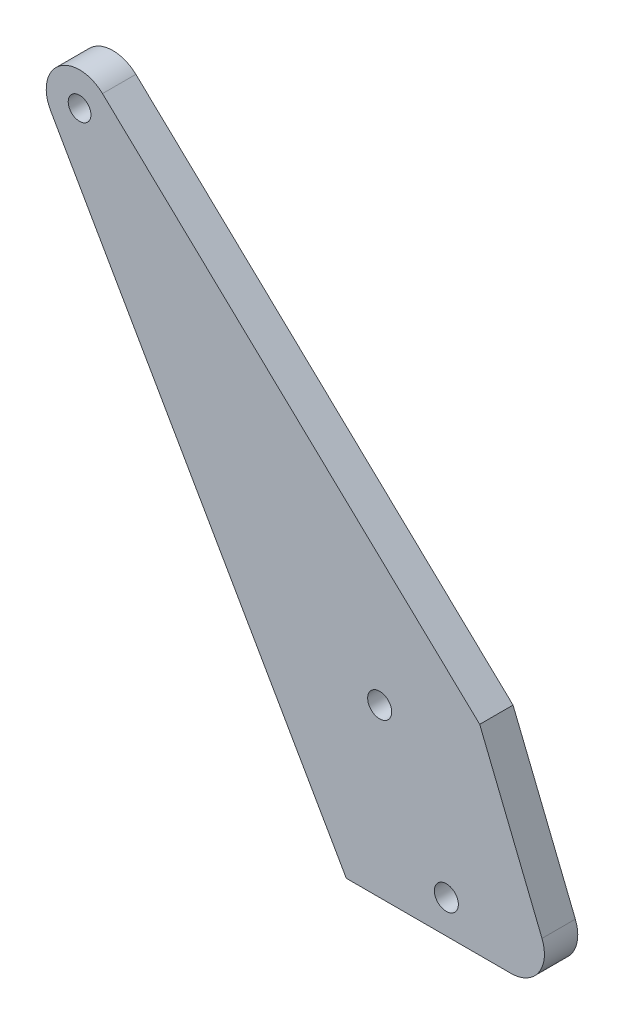
ISO-10303-21;
HEADER;
FILE_DESCRIPTION(('STEP AP214'),'2;1');
FILE_NAME('part.step','',(''),(''),'','','');
FILE_SCHEMA(('AUTOMOTIVE_DESIGN { 1 0 10303 214 1 1 1 1 }'));
ENDSEC;
DATA;
#1=APPLICATION_CONTEXT('core data for automotive mechanical design processes');
#2=APPLICATION_PROTOCOL_DEFINITION('international standard','automotive_design',2000,#1);
#3=PRODUCT_CONTEXT('',#1,'mechanical');
#4=PRODUCT('Part','Part','',(#3));
#5=PRODUCT_RELATED_PRODUCT_CATEGORY('part','',(#4));
#6=PRODUCT_DEFINITION_FORMATION('','',#4);
#7=PRODUCT_DEFINITION_CONTEXT('part definition',#1,'design');
#8=PRODUCT_DEFINITION('design','',#6,#7);
#9=PRODUCT_DEFINITION_SHAPE('','',#8);
#10=(LENGTH_UNIT() NAMED_UNIT(*) SI_UNIT(.MILLI.,.METRE.));
#11=(NAMED_UNIT(*) PLANE_ANGLE_UNIT() SI_UNIT($,.RADIAN.));
#12=(NAMED_UNIT(*) SI_UNIT($,.STERADIAN.) SOLID_ANGLE_UNIT());
#13=UNCERTAINTY_MEASURE_WITH_UNIT(LENGTH_MEASURE(1.E-05),#10,'distance_accuracy_value','');
#14=(GEOMETRIC_REPRESENTATION_CONTEXT(3) GLOBAL_UNCERTAINTY_ASSIGNED_CONTEXT((#13)) GLOBAL_UNIT_ASSIGNED_CONTEXT((#10,
#11,#12)) REPRESENTATION_CONTEXT('',''));
#15=CARTESIAN_POINT('',(0.,0.,0.));
#16=DIRECTION('',(0.,0.,1.));
#17=DIRECTION('',(1.,0.,0.));
#18=AXIS2_PLACEMENT_3D('',#15,#16,#17);
#19=CARTESIAN_POINT('',(0.,0.,-6.35));
#20=DIRECTION('',(0.,-1.,0.));
#21=DIRECTION('',(0.,0.,-1.));
#22=AXIS2_PLACEMENT_3D('',#19,#20,#21);
#23=PLANE('',#22);
#24=DIRECTION('',(1.,0.,0.));
#25=VECTOR('',#24,1.);
#26=CARTESIAN_POINT('',(15.3933992043195,0.,-6.35));
#27=LINE('',#26,#25);
#28=CARTESIAN_POINT('',(-25.4,0.,-6.35));
#29=VERTEX_POINT('',#28);
#30=CARTESIAN_POINT('',(5.97913705426362,0.,-6.35));
#31=VERTEX_POINT('',#30);
#32=EDGE_CURVE('E115',#29,#31,#27,.T.);
#33=ORIENTED_EDGE('',*,*,#32,.T.);
#34=DIRECTION('',(0.,0.,1.));
#35=VECTOR('',#34,1.);
#36=CARTESIAN_POINT('',(5.97913705426361,0.,-6.35));
#37=LINE('',#36,#35);
#38=CARTESIAN_POINT('',(5.97913705426361,0.,0.));
#39=VERTEX_POINT('',#38);
#40=EDGE_CURVE('E160',#31,#39,#37,.T.);
#41=ORIENTED_EDGE('',*,*,#40,.T.);
#42=DIRECTION('',(1.,0.,0.));
#43=VECTOR('',#42,1.);
#44=CARTESIAN_POINT('',(0.,0.,0.));
#45=LINE('',#44,#43);
#46=CARTESIAN_POINT('',(-25.4,0.,0.));
#47=VERTEX_POINT('',#46);
#48=EDGE_CURVE('E154',#47,#39,#45,.T.);
#49=ORIENTED_EDGE('',*,*,#48,.F.);
#50=DIRECTION('',(0.,0.,1.));
#51=VECTOR('',#50,1.);
#52=CARTESIAN_POINT('',(-25.4,0.,-6.35));
#53=LINE('',#52,#51);
#54=EDGE_CURVE('E157',#29,#47,#53,.T.);
#55=ORIENTED_EDGE('',*,*,#54,.F.);
#56=EDGE_LOOP('',(#33,#41,#49,#55));
#57=FACE_BOUND('',#56,.T.);
#58=ADVANCED_FACE('F49',(#57),#23,.T.);
#59=CARTESIAN_POINT('',(-81.7119813240942,98.4471343383664,-6.35));
#60=DIRECTION('',(-0.868028554975459,-0.49651427748577,0.));
#61=DIRECTION('',(0.49651427748577,-0.868028554975459,0.));
#62=AXIS2_PLACEMENT_3D('',#59,#60,#61);
#63=PLANE('',#62);
#64=DIRECTION('',(0.49651427748577,-0.868028554975459,0.));
#65=VECTOR('',#64,1.);
#66=CARTESIAN_POINT('',(-81.7119813240942,98.4471343383664,0.));
#67=LINE('',#66,#65);
#68=CARTESIAN_POINT('',(-81.7119813240942,98.4471343383664,0.));
#69=VERTEX_POINT('',#68);
#70=EDGE_CURVE('E150',#69,#47,#67,.T.);
#71=ORIENTED_EDGE('',*,*,#70,.F.);
#72=DIRECTION('',(0.,0.,1.));
#73=VECTOR('',#72,1.);
#74=CARTESIAN_POINT('',(-81.7119813240942,98.4471343383664,-6.35));
#75=LINE('',#74,#73);
#76=CARTESIAN_POINT('',(-81.7119813240942,98.4471343383664,-6.35));
#77=VERTEX_POINT('',#76);
#78=EDGE_CURVE('E161',#77,#69,#75,.T.);
#79=ORIENTED_EDGE('',*,*,#78,.F.);
#80=DIRECTION('',(0.49651427748577,-0.868028554975459,0.));
#81=VECTOR('',#80,1.);
#82=CARTESIAN_POINT('',(-81.7119813240942,98.4471343383664,-6.35));
#83=LINE('',#82,#81);
#84=EDGE_CURVE('E124',#77,#29,#83,.T.);
#85=ORIENTED_EDGE('',*,*,#84,.T.);
#86=ORIENTED_EDGE('',*,*,#54,.T.);
#87=EDGE_LOOP('',(#71,#79,#85,#86));
#88=FACE_BOUND('',#87,.T.);
#89=ADVANCED_FACE('F224',(#88),#63,.T.);
#90=CARTESIAN_POINT('',(-76.2,101.600000000401,-6.35));
#91=DIRECTION('',(0.,0.,1.));
#92=DIRECTION('',(1.,0.,0.));
#93=AXIS2_PLACEMENT_3D('',#90,#91,#92);
#94=CYLINDRICAL_SURFACE('',#93,6.34999999999999);
#95=CARTESIAN_POINT('',(-76.2,101.600000000401,0.));
#96=DIRECTION('',(0.,0.,1.));
#97=DIRECTION('',(1.,0.,0.));
#98=AXIS2_PLACEMENT_3D('',#95,#96,#97);
#99=CIRCLE('',#98,6.34999999999999);
#100=CARTESIAN_POINT('',(-71.830872801111,106.207952639039,0.));
#101=VERTEX_POINT('',#100);
#102=EDGE_CURVE('E147',#101,#69,#99,.T.);
#103=ORIENTED_EDGE('',*,*,#102,.F.);
#104=DIRECTION('',(0.,0.,1.));
#105=VECTOR('',#104,1.);
#106=CARTESIAN_POINT('',(-71.830872801111,106.207952639039,-6.35));
#107=LINE('',#106,#105);
#108=CARTESIAN_POINT('',(-71.830872801111,106.207952639039,-6.35));
#109=VERTEX_POINT('',#108);
#110=EDGE_CURVE('E123',#109,#101,#107,.T.);
#111=ORIENTED_EDGE('',*,*,#110,.F.);
#112=CARTESIAN_POINT('',(-76.2,101.600000000401,-6.35));
#113=DIRECTION('',(0.,0.,1.));
#114=DIRECTION('',(1.,0.,0.));
#115=AXIS2_PLACEMENT_3D('',#112,#113,#114);
#116=CIRCLE('',#115,6.34999999999999);
#117=EDGE_CURVE('E130',#109,#77,#116,.T.);
#118=ORIENTED_EDGE('',*,*,#117,.T.);
#119=ORIENTED_EDGE('',*,*,#78,.T.);
#120=EDGE_LOOP('',(#103,#111,#118,#119));
#121=FACE_BOUND('',#120,.T.);
#122=ADVANCED_FACE('F223',(#121),#94,.T.);
#123=CARTESIAN_POINT('',(-71.830872801111,106.207952639039,-6.35));
#124=DIRECTION('',(0.688051527384096,0.725661832856333,0.));
#125=DIRECTION('',(-0.725661832856333,0.688051527384096,0.));
#126=AXIS2_PLACEMENT_3D('',#123,#124,#125);
#127=PLANE('',#126);
#128=DIRECTION('',(-0.725661832856333,0.688051527384096,0.));
#129=VECTOR('',#128,1.);
#130=CARTESIAN_POINT('',(-71.830872801111,106.207952639039,0.));
#131=LINE('',#130,#129);
#132=CARTESIAN_POINT('',(0.,38.1,0.));
#133=VERTEX_POINT('',#132);
#134=EDGE_CURVE('E121',#133,#101,#131,.T.);
#135=ORIENTED_EDGE('',*,*,#134,.F.);
#136=DIRECTION('',(0.,0.,1.));
#137=VECTOR('',#136,1.);
#138=CARTESIAN_POINT('',(0.,38.1,-6.35));
#139=LINE('',#138,#137);
#140=CARTESIAN_POINT('',(0.,38.1,-6.35));
#141=VERTEX_POINT('',#140);
#142=EDGE_CURVE('E108',#141,#133,#139,.T.);
#143=ORIENTED_EDGE('',*,*,#142,.F.);
#144=DIRECTION('',(-0.725661832856333,0.688051527384096,0.));
#145=VECTOR('',#144,1.);
#146=CARTESIAN_POINT('',(-71.830872801111,106.207952639039,-6.35));
#147=LINE('',#146,#145);
#148=EDGE_CURVE('E114',#141,#109,#147,.T.);
#149=ORIENTED_EDGE('',*,*,#148,.T.);
#150=ORIENTED_EDGE('',*,*,#110,.T.);
#151=EDGE_LOOP('',(#135,#143,#149,#150));
#152=FACE_BOUND('',#151,.T.);
#153=ADVANCED_FACE('F119',(#152),#127,.T.);
#154=CARTESIAN_POINT('',(0.,38.1,-6.35));
#155=DIRECTION('',(0.927183854566787,0.374606593415913,0.));
#156=DIRECTION('',(-0.374606593415913,0.927183854566787,0.));
#157=AXIS2_PLACEMENT_3D('',#154,#155,#156);
#158=PLANE('',#157);
#159=DIRECTION('',(-0.374606593415913,0.927183854566787,0.));
#160=VECTOR('',#159,1.);
#161=CARTESIAN_POINT('',(0.,38.1,0.));
#162=LINE('',#161,#160);
#163=CARTESIAN_POINT('',(11.8667545307627,8.72875186819105,0.));
#164=VERTEX_POINT('',#163);
#165=EDGE_CURVE('E141',#164,#133,#162,.T.);
#166=ORIENTED_EDGE('',*,*,#165,.F.);
#167=DIRECTION('',(0.,0.,1.));
#168=VECTOR('',#167,1.);
#169=CARTESIAN_POINT('',(11.8667545307627,8.72875186819105,-6.35));
#170=LINE('',#169,#168);
#171=CARTESIAN_POINT('',(11.8667545307627,8.72875186819105,-6.35));
#172=VERTEX_POINT('',#171);
#173=EDGE_CURVE('E58',#164,#172,#170,.F.);
#174=ORIENTED_EDGE('',*,*,#173,.T.);
#175=DIRECTION('',(-0.374606593415913,0.927183854566787,0.));
#176=VECTOR('',#175,1.);
#177=CARTESIAN_POINT('',(0.,38.1,-6.35));
#178=LINE('',#177,#176);
#179=EDGE_CURVE('E105',#172,#141,#178,.T.);
#180=ORIENTED_EDGE('',*,*,#179,.T.);
#181=ORIENTED_EDGE('',*,*,#142,.T.);
#182=EDGE_LOOP('',(#166,#174,#180,#181));
#183=FACE_BOUND('',#182,.T.);
#184=ADVANCED_FACE('F107',(#183),#158,.T.);
#185=CARTESIAN_POINT('',(-76.2,101.600000000401,-6.35));
#186=DIRECTION('',(0.,0.,1.));
#187=DIRECTION('',(1.,0.,0.));
#188=AXIS2_PLACEMENT_3D('',#185,#186,#187);
#189=PLANE('',#188);
#190=CARTESIAN_POINT('',(-6.35,6.35,-6.35));
#191=DIRECTION('',(0.,0.,1.));
#192=DIRECTION('',(1.,0.,0.));
#193=AXIS2_PLACEMENT_3D('',#190,#191,#192);
#194=CIRCLE('',#193,2.286);
#195=CARTESIAN_POINT('',(-4.064,6.35,-6.35));
#196=VERTEX_POINT('',#195);
#197=EDGE_CURVE('E172',#196,#196,#194,.T.);
#198=ORIENTED_EDGE('',*,*,#197,.T.);
#199=EDGE_LOOP('',(#198));
#200=FACE_BOUND('',#199,.T.);
#201=CARTESIAN_POINT('',(-76.2,101.600000000401,-6.35));
#202=DIRECTION('',(0.,0.,1.));
#203=DIRECTION('',(1.,0.,0.));
#204=AXIS2_PLACEMENT_3D('',#201,#202,#203);
#205=CIRCLE('',#204,2.15899999991975);
#206=CARTESIAN_POINT('',(-74.0410000000803,101.600000000401,-6.35));
#207=VERTEX_POINT('',#206);
#208=EDGE_CURVE('E190',#207,#207,#205,.T.);
#209=ORIENTED_EDGE('',*,*,#208,.T.);
#210=EDGE_LOOP('',(#209));
#211=FACE_BOUND('',#210,.T.);
#212=CARTESIAN_POINT('',(-19.05,31.75,-6.35));
#213=DIRECTION('',(0.,0.,1.));
#214=DIRECTION('',(1.,0.,0.));
#215=AXIS2_PLACEMENT_3D('',#212,#213,#214);
#216=CIRCLE('',#215,2.286);
#217=CARTESIAN_POINT('',(-16.764,31.75,-6.35));
#218=VERTEX_POINT('',#217);
#219=EDGE_CURVE('E144',#218,#218,#216,.T.);
#220=ORIENTED_EDGE('',*,*,#219,.T.);
#221=EDGE_LOOP('',(#220));
#222=FACE_BOUND('',#221,.T.);
#223=ORIENTED_EDGE('',*,*,#179,.F.);
#224=CARTESIAN_POINT('',(5.97913705426361,6.35,-6.35));
#225=DIRECTION('',(0.,0.,1.));
#226=DIRECTION('',(1.,0.,0.));
#227=AXIS2_PLACEMENT_3D('',#224,#225,#226);
#228=CIRCLE('',#227,6.35);
#229=EDGE_CURVE('E11',#172,#31,#228,.F.);
#230=ORIENTED_EDGE('',*,*,#229,.T.);
#231=ORIENTED_EDGE('',*,*,#32,.F.);
#232=ORIENTED_EDGE('',*,*,#84,.F.);
#233=ORIENTED_EDGE('',*,*,#117,.F.);
#234=ORIENTED_EDGE('',*,*,#148,.F.);
#235=EDGE_LOOP('',(#223,#230,#231,#232,#233,#234));
#236=FACE_BOUND('',#235,.T.);
#237=ADVANCED_FACE('F127',(#200,#211,#222,#236),#189,.F.);
#238=CARTESIAN_POINT('',(-76.2,101.600000000401,0.));
#239=DIRECTION('',(0.,0.,1.));
#240=DIRECTION('',(1.,0.,0.));
#241=AXIS2_PLACEMENT_3D('',#238,#239,#240);
#242=PLANE('',#241);
#243=CARTESIAN_POINT('',(-6.35,6.35,0.));
#244=DIRECTION('',(0.,0.,1.));
#245=DIRECTION('',(1.,0.,0.));
#246=AXIS2_PLACEMENT_3D('',#243,#244,#245);
#247=CIRCLE('',#246,2.286);
#248=CARTESIAN_POINT('',(-4.064,6.35,0.));
#249=VERTEX_POINT('',#248);
#250=EDGE_CURVE('E176',#249,#249,#247,.T.);
#251=ORIENTED_EDGE('',*,*,#250,.F.);
#252=EDGE_LOOP('',(#251));
#253=FACE_BOUND('',#252,.T.);
#254=CARTESIAN_POINT('',(-76.2,101.600000000401,0.));
#255=DIRECTION('',(0.,0.,1.));
#256=DIRECTION('',(1.,0.,0.));
#257=AXIS2_PLACEMENT_3D('',#254,#255,#256);
#258=CIRCLE('',#257,2.15899999991975);
#259=CARTESIAN_POINT('',(-74.0410000000803,101.600000000401,0.));
#260=VERTEX_POINT('',#259);
#261=EDGE_CURVE('E175',#260,#260,#258,.T.);
#262=ORIENTED_EDGE('',*,*,#261,.F.);
#263=EDGE_LOOP('',(#262));
#264=FACE_BOUND('',#263,.T.);
#265=CARTESIAN_POINT('',(-19.05,31.75,0.));
#266=DIRECTION('',(0.,0.,1.));
#267=DIRECTION('',(1.,0.,0.));
#268=AXIS2_PLACEMENT_3D('',#265,#266,#267);
#269=CIRCLE('',#268,2.286);
#270=CARTESIAN_POINT('',(-16.764,31.75,0.));
#271=VERTEX_POINT('',#270);
#272=EDGE_CURVE('E186',#271,#271,#269,.T.);
#273=ORIENTED_EDGE('',*,*,#272,.F.);
#274=EDGE_LOOP('',(#273));
#275=FACE_BOUND('',#274,.T.);
#276=ORIENTED_EDGE('',*,*,#48,.T.);
#277=CARTESIAN_POINT('',(5.97913705426361,6.35,0.));
#278=DIRECTION('',(0.,0.,1.));
#279=DIRECTION('',(1.,0.,0.));
#280=AXIS2_PLACEMENT_3D('',#277,#278,#279);
#281=CIRCLE('',#280,6.35);
#282=EDGE_CURVE('E75',#39,#164,#281,.T.);
#283=ORIENTED_EDGE('',*,*,#282,.T.);
#284=ORIENTED_EDGE('',*,*,#165,.T.);
#285=ORIENTED_EDGE('',*,*,#134,.T.);
#286=ORIENTED_EDGE('',*,*,#102,.T.);
#287=ORIENTED_EDGE('',*,*,#70,.T.);
#288=EDGE_LOOP('',(#276,#283,#284,#285,#286,#287));
#289=FACE_BOUND('',#288,.T.);
#290=ADVANCED_FACE('F211',(#253,#264,#275,#289),#242,.T.);
#291=CARTESIAN_POINT('',(-19.05,31.75,-6.35));
#292=DIRECTION('',(0.,0.,1.));
#293=DIRECTION('',(1.,0.,0.));
#294=AXIS2_PLACEMENT_3D('',#291,#292,#293);
#295=CYLINDRICAL_SURFACE('',#294,2.286);
#296=ORIENTED_EDGE('',*,*,#219,.F.);
#297=EDGE_LOOP('',(#296));
#298=FACE_BOUND('',#297,.T.);
#299=ORIENTED_EDGE('',*,*,#272,.T.);
#300=EDGE_LOOP('',(#299));
#301=FACE_BOUND('',#300,.T.);
#302=ADVANCED_FACE('F207',(#298,#301),#295,.F.);
#303=CARTESIAN_POINT('',(-76.2,101.600000000401,-6.35));
#304=DIRECTION('',(0.,0.,1.));
#305=DIRECTION('',(1.,0.,0.));
#306=AXIS2_PLACEMENT_3D('',#303,#304,#305);
#307=CYLINDRICAL_SURFACE('',#306,2.15899999991975);
#308=ORIENTED_EDGE('',*,*,#208,.F.);
#309=EDGE_LOOP('',(#308));
#310=FACE_BOUND('',#309,.T.);
#311=ORIENTED_EDGE('',*,*,#261,.T.);
#312=EDGE_LOOP('',(#311));
#313=FACE_BOUND('',#312,.T.);
#314=ADVANCED_FACE('F203',(#310,#313),#307,.F.);
#315=CARTESIAN_POINT('',(-6.35,6.35,-6.35));
#316=DIRECTION('',(0.,0.,1.));
#317=DIRECTION('',(1.,0.,0.));
#318=AXIS2_PLACEMENT_3D('',#315,#316,#317);
#319=CYLINDRICAL_SURFACE('',#318,2.286);
#320=ORIENTED_EDGE('',*,*,#197,.F.);
#321=EDGE_LOOP('',(#320));
#322=FACE_BOUND('',#321,.T.);
#323=ORIENTED_EDGE('',*,*,#250,.T.);
#324=EDGE_LOOP('',(#323));
#325=FACE_BOUND('',#324,.T.);
#326=ADVANCED_FACE('F206',(#322,#325),#319,.F.);
#327=CARTESIAN_POINT('',(5.97913705426361,6.35,-6.35));
#328=DIRECTION('',(0.,0.,1.));
#329=DIRECTION('',(1.,0.,0.));
#330=AXIS2_PLACEMENT_3D('',#327,#328,#329);
#331=CYLINDRICAL_SURFACE('',#330,6.35);
#332=ORIENTED_EDGE('',*,*,#229,.F.);
#333=ORIENTED_EDGE('',*,*,#173,.F.);
#334=ORIENTED_EDGE('',*,*,#282,.F.);
#335=ORIENTED_EDGE('',*,*,#40,.F.);
#336=EDGE_LOOP('',(#332,#333,#334,#335));
#337=FACE_BOUND('',#336,.T.);
#338=ADVANCED_FACE('F51',(#337),#331,.T.);
#339=CLOSED_SHELL('',(#58,#89,#122,#153,#184,#237,#290,#302,#314,#326,#338));
#340=MANIFOLD_SOLID_BREP('B2',#339);
#341=ADVANCED_BREP_SHAPE_REPRESENTATION('',(#18,#340),#14);
#342=SHAPE_DEFINITION_REPRESENTATION(#9,#341);
ENDSEC;
END-ISO-10303-21;
